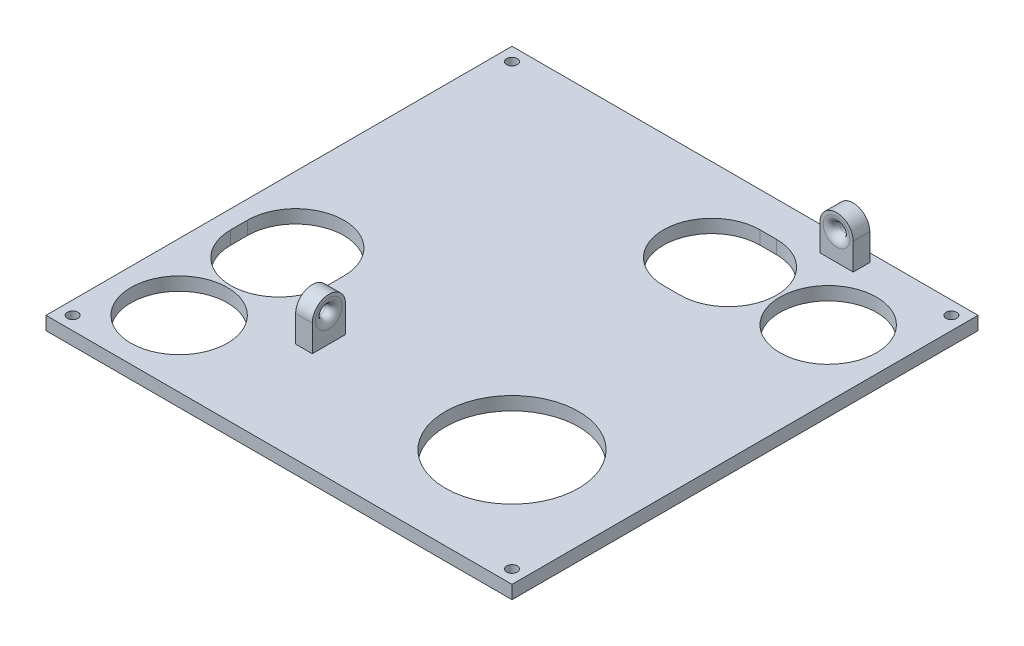
ISO-10303-21;
HEADER;
FILE_DESCRIPTION(('STEP AP214'),'2;1');
FILE_NAME('part.step','',(''),(''),'','','');
FILE_SCHEMA(('AUTOMOTIVE_DESIGN { 1 0 10303 214 1 1 1 1 }'));
ENDSEC;
DATA;
#1=APPLICATION_CONTEXT('core data for automotive mechanical design processes');
#2=APPLICATION_PROTOCOL_DEFINITION('international standard','automotive_design',2000,#1);
#3=PRODUCT_CONTEXT('',#1,'mechanical');
#4=PRODUCT('Part','Part','',(#3));
#5=PRODUCT_RELATED_PRODUCT_CATEGORY('part','',(#4));
#6=PRODUCT_DEFINITION_FORMATION('','',#4);
#7=PRODUCT_DEFINITION_CONTEXT('part definition',#1,'design');
#8=PRODUCT_DEFINITION('design','',#6,#7);
#9=PRODUCT_DEFINITION_SHAPE('','',#8);
#10=(LENGTH_UNIT() NAMED_UNIT(*) SI_UNIT(.MILLI.,.METRE.));
#11=(NAMED_UNIT(*) PLANE_ANGLE_UNIT() SI_UNIT($,.RADIAN.));
#12=(NAMED_UNIT(*) SI_UNIT($,.STERADIAN.) SOLID_ANGLE_UNIT());
#13=UNCERTAINTY_MEASURE_WITH_UNIT(LENGTH_MEASURE(1.E-05),#10,'distance_accuracy_value','');
#14=(GEOMETRIC_REPRESENTATION_CONTEXT(3) GLOBAL_UNCERTAINTY_ASSIGNED_CONTEXT((#13)) GLOBAL_UNIT_ASSIGNED_CONTEXT((#10,
#11,#12)) REPRESENTATION_CONTEXT('',''));
#15=CARTESIAN_POINT('',(0.,0.,0.));
#16=DIRECTION('',(0.,0.,1.));
#17=DIRECTION('',(1.,0.,0.));
#18=AXIS2_PLACEMENT_3D('',#15,#16,#17);
#19=CARTESIAN_POINT('',(-25.,18.,30.));
#20=DIRECTION('',(0.,0.,1.));
#21=DIRECTION('',(1.,0.,0.));
#22=AXIS2_PLACEMENT_3D('',#19,#20,#21);
#23=PLANE('',#22);
#24=DIRECTION('',(1.,0.,0.));
#25=VECTOR('',#24,1.);
#26=CARTESIAN_POINT('',(-25.,12.,30.));
#27=LINE('',#26,#25);
#28=CARTESIAN_POINT('',(-25.,12.,30.));
#29=VERTEX_POINT('',#28);
#30=CARTESIAN_POINT('',(-20.,12.,30.));
#31=VERTEX_POINT('',#30);
#32=EDGE_CURVE('E174',#29,#31,#27,.T.);
#33=ORIENTED_EDGE('',*,*,#32,.T.);
#34=DIRECTION('',(0.,-1.,0.));
#35=VECTOR('',#34,1.);
#36=CARTESIAN_POINT('',(-20.,18.,30.));
#37=LINE('',#36,#35);
#38=CARTESIAN_POINT('',(-20.,4.,30.));
#39=VERTEX_POINT('',#38);
#40=EDGE_CURVE('E194',#31,#39,#37,.T.);
#41=ORIENTED_EDGE('',*,*,#40,.T.);
#42=DIRECTION('',(-1.,0.,0.));
#43=VECTOR('',#42,1.);
#44=CARTESIAN_POINT('',(-25.,4.,30.));
#45=LINE('',#44,#43);
#46=CARTESIAN_POINT('',(-25.,4.,30.));
#47=VERTEX_POINT('',#46);
#48=EDGE_CURVE('E192',#39,#47,#45,.T.);
#49=ORIENTED_EDGE('',*,*,#48,.T.);
#50=DIRECTION('',(0.,-1.,0.));
#51=VECTOR('',#50,1.);
#52=CARTESIAN_POINT('',(-25.,18.,30.));
#53=LINE('',#52,#51);
#54=EDGE_CURVE('E187',#29,#47,#53,.T.);
#55=ORIENTED_EDGE('',*,*,#54,.F.);
#56=EDGE_LOOP('',(#33,#41,#49,#55));
#57=FACE_BOUND('',#56,.T.);
#58=ADVANCED_FACE('F37',(#57),#23,.F.);
#59=CARTESIAN_POINT('',(40.,18.,-67.5));
#60=DIRECTION('',(-1.,0.,0.));
#61=DIRECTION('',(0.,0.,1.));
#62=AXIS2_PLACEMENT_3D('',#59,#60,#61);
#63=PLANE('',#62);
#64=DIRECTION('',(0.,0.,1.));
#65=VECTOR('',#64,1.);
#66=CARTESIAN_POINT('',(40.,12.,-70.));
#67=LINE('',#66,#65);
#68=CARTESIAN_POINT('',(40.,12.,-67.5));
#69=VERTEX_POINT('',#68);
#70=CARTESIAN_POINT('',(40.,12.,-62.5));
#71=VERTEX_POINT('',#70);
#72=EDGE_CURVE('E530',#69,#71,#67,.T.);
#73=ORIENTED_EDGE('',*,*,#72,.T.);
#74=DIRECTION('',(0.,-1.,0.));
#75=VECTOR('',#74,1.);
#76=CARTESIAN_POINT('',(40.,18.,-62.5));
#77=LINE('',#76,#75);
#78=CARTESIAN_POINT('',(40.,4.,-62.5));
#79=VERTEX_POINT('',#78);
#80=EDGE_CURVE('E481',#71,#79,#77,.T.);
#81=ORIENTED_EDGE('',*,*,#80,.T.);
#82=DIRECTION('',(0.,0.,-1.));
#83=VECTOR('',#82,1.);
#84=CARTESIAN_POINT('',(40.,4.,-67.5));
#85=LINE('',#84,#83);
#86=CARTESIAN_POINT('',(40.,4.,-67.5));
#87=VERTEX_POINT('',#86);
#88=EDGE_CURVE('E520',#79,#87,#85,.T.);
#89=ORIENTED_EDGE('',*,*,#88,.T.);
#90=DIRECTION('',(0.,-1.,0.));
#91=VECTOR('',#90,1.);
#92=CARTESIAN_POINT('',(40.,18.,-67.5));
#93=LINE('',#92,#91);
#94=EDGE_CURVE('E498',#69,#87,#93,.T.);
#95=ORIENTED_EDGE('',*,*,#94,.F.);
#96=EDGE_LOOP('',(#73,#81,#89,#95));
#97=FACE_BOUND('',#96,.T.);
#98=ADVANCED_FACE('F366',(#97),#63,.F.);
#99=CARTESIAN_POINT('',(0.,4.,0.));
#100=DIRECTION('',(0.,1.,0.));
#101=DIRECTION('',(0.,0.,1.));
#102=AXIS2_PLACEMENT_3D('',#99,#100,#101);
#103=PLANE('',#102);
#104=DIRECTION('',(0.,0.,1.));
#105=VECTOR('',#104,1.);
#106=CARTESIAN_POINT('',(-64.5,4.,20.));
#107=LINE('',#106,#105);
#108=CARTESIAN_POINT('',(-64.5,4.,15.));
#109=VERTEX_POINT('',#108);
#110=CARTESIAN_POINT('',(-64.5,4.,20.));
#111=VERTEX_POINT('',#110);
#112=EDGE_CURVE('E209',#109,#111,#107,.T.);
#113=ORIENTED_EDGE('',*,*,#112,.F.);
#114=CARTESIAN_POINT('',(-50.,4.,15.));
#115=DIRECTION('',(0.,1.,0.));
#116=DIRECTION('',(0.,0.,1.));
#117=AXIS2_PLACEMENT_3D('',#114,#115,#116);
#118=CIRCLE('',#117,14.5);
#119=CARTESIAN_POINT('',(-35.5,4.,15.));
#120=VERTEX_POINT('',#119);
#121=EDGE_CURVE('E205',#120,#109,#118,.T.);
#122=ORIENTED_EDGE('',*,*,#121,.F.);
#123=DIRECTION('',(0.,0.,-1.));
#124=VECTOR('',#123,1.);
#125=CARTESIAN_POINT('',(-35.5,4.,20.));
#126=LINE('',#125,#124);
#127=CARTESIAN_POINT('',(-35.5,4.,20.));
#128=VERTEX_POINT('',#127);
#129=EDGE_CURVE('E202',#128,#120,#126,.T.);
#130=ORIENTED_EDGE('',*,*,#129,.F.);
#131=CARTESIAN_POINT('',(-50.,4.,20.));
#132=DIRECTION('',(0.,1.,0.));
#133=DIRECTION('',(0.,0.,1.));
#134=AXIS2_PLACEMENT_3D('',#131,#132,#133);
#135=CIRCLE('',#134,14.5);
#136=EDGE_CURVE('E271',#111,#128,#135,.T.);
#137=ORIENTED_EDGE('',*,*,#136,.F.);
#138=EDGE_LOOP('',(#113,#122,#130,#137));
#139=FACE_BOUND('',#138,.T.);
#140=DIRECTION('',(1.,0.,0.));
#141=VECTOR('',#140,1.);
#142=CARTESIAN_POINT('',(20.,4.,-30.5));
#143=LINE('',#142,#141);
#144=CARTESIAN_POINT('',(15.,4.,-30.5));
#145=VERTEX_POINT('',#144);
#146=CARTESIAN_POINT('',(20.,4.,-30.5));
#147=VERTEX_POINT('',#146);
#148=EDGE_CURVE('E221',#145,#147,#143,.T.);
#149=ORIENTED_EDGE('',*,*,#148,.F.);
#150=CARTESIAN_POINT('',(15.,4.,-45.));
#151=DIRECTION('',(0.,1.,0.));
#152=DIRECTION('',(0.,0.,1.));
#153=AXIS2_PLACEMENT_3D('',#150,#151,#152);
#154=CIRCLE('',#153,14.5);
#155=CARTESIAN_POINT('',(15.,4.,-59.5));
#156=VERTEX_POINT('',#155);
#157=EDGE_CURVE('E218',#156,#145,#154,.T.);
#158=ORIENTED_EDGE('',*,*,#157,.F.);
#159=DIRECTION('',(-1.,0.,0.));
#160=VECTOR('',#159,1.);
#161=CARTESIAN_POINT('',(20.,4.,-59.5));
#162=LINE('',#161,#160);
#163=CARTESIAN_POINT('',(20.,4.,-59.5));
#164=VERTEX_POINT('',#163);
#165=EDGE_CURVE('E196',#164,#156,#162,.T.);
#166=ORIENTED_EDGE('',*,*,#165,.F.);
#167=CARTESIAN_POINT('',(20.,4.,-45.));
#168=DIRECTION('',(0.,1.,0.));
#169=DIRECTION('',(0.,0.,1.));
#170=AXIS2_PLACEMENT_3D('',#167,#168,#169);
#171=CIRCLE('',#170,14.5);
#172=EDGE_CURVE('E265',#147,#164,#171,.T.);
#173=ORIENTED_EDGE('',*,*,#172,.F.);
#174=EDGE_LOOP('',(#149,#158,#166,#173));
#175=FACE_BOUND('',#174,.T.);
#176=CARTESIAN_POINT('',(-66.,4.,66.));
#177=DIRECTION('',(0.,1.,0.));
#178=DIRECTION('',(0.,0.,1.));
#179=AXIS2_PLACEMENT_3D('',#176,#177,#178);
#180=CIRCLE('',#179,1.60000000000001);
#181=CARTESIAN_POINT('',(-66.,4.,67.6));
#182=VERTEX_POINT('',#181);
#183=EDGE_CURVE('E237',#182,#182,#180,.T.);
#184=ORIENTED_EDGE('',*,*,#183,.F.);
#185=EDGE_LOOP('',(#184));
#186=FACE_BOUND('',#185,.T.);
#187=CARTESIAN_POINT('',(66.,4.,66.));
#188=DIRECTION('',(0.,1.,0.));
#189=DIRECTION('',(0.,0.,1.));
#190=AXIS2_PLACEMENT_3D('',#187,#188,#189);
#191=CIRCLE('',#190,1.60000000000001);
#192=CARTESIAN_POINT('',(66.,4.,67.6));
#193=VERTEX_POINT('',#192);
#194=EDGE_CURVE('E242',#193,#193,#191,.T.);
#195=ORIENTED_EDGE('',*,*,#194,.F.);
#196=EDGE_LOOP('',(#195));
#197=FACE_BOUND('',#196,.T.);
#198=CARTESIAN_POINT('',(66.,4.,-66.));
#199=DIRECTION('',(0.,1.,0.));
#200=DIRECTION('',(0.,0.,1.));
#201=AXIS2_PLACEMENT_3D('',#198,#199,#200);
#202=CIRCLE('',#201,1.60000000000001);
#203=CARTESIAN_POINT('',(66.,4.,-64.4));
#204=VERTEX_POINT('',#203);
#205=EDGE_CURVE('E238',#204,#204,#202,.T.);
#206=ORIENTED_EDGE('',*,*,#205,.F.);
#207=EDGE_LOOP('',(#206));
#208=FACE_BOUND('',#207,.T.);
#209=CARTESIAN_POINT('',(-66.,4.,-66.));
#210=DIRECTION('',(0.,1.,0.));
#211=DIRECTION('',(0.,0.,1.));
#212=AXIS2_PLACEMENT_3D('',#209,#210,#211);
#213=CIRCLE('',#212,1.60000000000001);
#214=CARTESIAN_POINT('',(-66.,4.,-64.4));
#215=VERTEX_POINT('',#214);
#216=EDGE_CURVE('E241',#215,#215,#213,.T.);
#217=ORIENTED_EDGE('',*,*,#216,.F.);
#218=EDGE_LOOP('',(#217));
#219=FACE_BOUND('',#218,.T.);
#220=CARTESIAN_POINT('',(35.,4.,35.));
#221=DIRECTION('',(0.,1.,0.));
#222=DIRECTION('',(0.,0.,1.));
#223=AXIS2_PLACEMENT_3D('',#220,#221,#222);
#224=CIRCLE('',#223,20.);
#225=CARTESIAN_POINT('',(35.,4.,55.));
#226=VERTEX_POINT('',#225);
#227=EDGE_CURVE('E250',#226,#226,#224,.T.);
#228=ORIENTED_EDGE('',*,*,#227,.F.);
#229=EDGE_LOOP('',(#228));
#230=FACE_BOUND('',#229,.T.);
#231=CARTESIAN_POINT('',(50.,4.,-45.));
#232=DIRECTION('',(0.,1.,0.));
#233=DIRECTION('',(0.,0.,1.));
#234=AXIS2_PLACEMENT_3D('',#231,#232,#233);
#235=CIRCLE('',#234,14.5);
#236=CARTESIAN_POINT('',(50.,4.,-30.5));
#237=VERTEX_POINT('',#236);
#238=EDGE_CURVE('E259',#237,#237,#235,.T.);
#239=ORIENTED_EDGE('',*,*,#238,.F.);
#240=EDGE_LOOP('',(#239));
#241=FACE_BOUND('',#240,.T.);
#242=CARTESIAN_POINT('',(-50.,4.,50.));
#243=DIRECTION('',(0.,1.,0.));
#244=DIRECTION('',(0.,0.,1.));
#245=AXIS2_PLACEMENT_3D('',#242,#243,#244);
#246=CIRCLE('',#245,14.5);
#247=CARTESIAN_POINT('',(-50.,4.,64.5));
#248=VERTEX_POINT('',#247);
#249=EDGE_CURVE('E277',#248,#248,#246,.T.);
#250=ORIENTED_EDGE('',*,*,#249,.F.);
#251=EDGE_LOOP('',(#250));
#252=FACE_BOUND('',#251,.T.);
#253=DIRECTION('',(0.,0.,-1.));
#254=VECTOR('',#253,1.);
#255=CARTESIAN_POINT('',(70.,4.,-70.));
#256=LINE('',#255,#254);
#257=CARTESIAN_POINT('',(70.,4.,70.));
#258=VERTEX_POINT('',#257);
#259=CARTESIAN_POINT('',(70.,4.,-70.));
#260=VERTEX_POINT('',#259);
#261=EDGE_CURVE('E280',#258,#260,#256,.T.);
#262=ORIENTED_EDGE('',*,*,#261,.T.);
#263=DIRECTION('',(-1.,0.,0.));
#264=VECTOR('',#263,1.);
#265=CARTESIAN_POINT('',(-70.,4.,-70.));
#266=LINE('',#265,#264);
#267=CARTESIAN_POINT('',(-70.,4.,-70.));
#268=VERTEX_POINT('',#267);
#269=EDGE_CURVE('E283',#260,#268,#266,.T.);
#270=ORIENTED_EDGE('',*,*,#269,.T.);
#271=DIRECTION('',(0.,0.,1.));
#272=VECTOR('',#271,1.);
#273=CARTESIAN_POINT('',(-70.,4.,-70.));
#274=LINE('',#273,#272);
#275=CARTESIAN_POINT('',(-70.,4.,70.));
#276=VERTEX_POINT('',#275);
#277=EDGE_CURVE('E286',#268,#276,#274,.T.);
#278=ORIENTED_EDGE('',*,*,#277,.T.);
#279=DIRECTION('',(1.,0.,0.));
#280=VECTOR('',#279,1.);
#281=CARTESIAN_POINT('',(-70.,4.,70.));
#282=LINE('',#281,#280);
#283=EDGE_CURVE('E288',#276,#258,#282,.T.);
#284=ORIENTED_EDGE('',*,*,#283,.T.);
#285=EDGE_LOOP('',(#262,#270,#278,#284));
#286=FACE_BOUND('',#285,.T.);
#287=ORIENTED_EDGE('',*,*,#48,.F.);
#288=DIRECTION('',(0.,0.,-1.));
#289=VECTOR('',#288,1.);
#290=CARTESIAN_POINT('',(-20.,4.,30.));
#291=LINE('',#290,#289);
#292=CARTESIAN_POINT('',(-20.,4.,40.));
#293=VERTEX_POINT('',#292);
#294=EDGE_CURVE('E500',#293,#39,#291,.T.);
#295=ORIENTED_EDGE('',*,*,#294,.F.);
#296=DIRECTION('',(1.,0.,0.));
#297=VECTOR('',#296,1.);
#298=CARTESIAN_POINT('',(-25.,4.,40.));
#299=LINE('',#298,#297);
#300=CARTESIAN_POINT('',(-25.,4.,40.));
#301=VERTEX_POINT('',#300);
#302=EDGE_CURVE('E506',#301,#293,#299,.T.);
#303=ORIENTED_EDGE('',*,*,#302,.F.);
#304=DIRECTION('',(0.,0.,1.));
#305=VECTOR('',#304,1.);
#306=CARTESIAN_POINT('',(-25.,4.,30.));
#307=LINE('',#306,#305);
#308=EDGE_CURVE('E504',#47,#301,#307,.T.);
#309=ORIENTED_EDGE('',*,*,#308,.F.);
#310=EDGE_LOOP('',(#287,#295,#303,#309));
#311=FACE_BOUND('',#310,.T.);
#312=DIRECTION('',(-1.,0.,0.));
#313=VECTOR('',#312,1.);
#314=CARTESIAN_POINT('',(30.,4.,-67.5));
#315=LINE('',#314,#313);
#316=CARTESIAN_POINT('',(30.,4.,-67.5));
#317=VERTEX_POINT('',#316);
#318=EDGE_CURVE('E519',#87,#317,#315,.T.);
#319=ORIENTED_EDGE('',*,*,#318,.F.);
#320=ORIENTED_EDGE('',*,*,#88,.F.);
#321=DIRECTION('',(1.,0.,0.));
#322=VECTOR('',#321,1.);
#323=CARTESIAN_POINT('',(30.,4.,-62.5));
#324=LINE('',#323,#322);
#325=CARTESIAN_POINT('',(30.,4.,-62.5));
#326=VERTEX_POINT('',#325);
#327=EDGE_CURVE('E485',#326,#79,#324,.T.);
#328=ORIENTED_EDGE('',*,*,#327,.F.);
#329=DIRECTION('',(0.,0.,1.));
#330=VECTOR('',#329,1.);
#331=CARTESIAN_POINT('',(30.,4.,-67.5));
#332=LINE('',#331,#330);
#333=EDGE_CURVE('E493',#317,#326,#332,.T.);
#334=ORIENTED_EDGE('',*,*,#333,.F.);
#335=EDGE_LOOP('',(#319,#320,#328,#334));
#336=FACE_BOUND('',#335,.T.);
#337=ADVANCED_FACE('F371',(#139,#175,#186,#197,#208,#219,#230,#241,#252,#286,#311,#336),#103,.T.);
#338=CARTESIAN_POINT('',(-50.,0.,20.));
#339=DIRECTION('',(0.,1.,0.));
#340=DIRECTION('',(0.,0.,1.));
#341=AXIS2_PLACEMENT_3D('',#338,#339,#340);
#342=CYLINDRICAL_SURFACE('',#341,14.5);
#343=DIRECTION('',(0.,1.,0.));
#344=VECTOR('',#343,1.);
#345=CARTESIAN_POINT('',(-64.5,0.,20.));
#346=LINE('',#345,#344);
#347=CARTESIAN_POINT('',(-64.5,0.,20.));
#348=VERTEX_POINT('',#347);
#349=EDGE_CURVE('E329',#111,#348,#346,.F.);
#350=ORIENTED_EDGE('',*,*,#349,.F.);
#351=ORIENTED_EDGE('',*,*,#136,.T.);
#352=DIRECTION('',(0.,1.,0.));
#353=VECTOR('',#352,1.);
#354=CARTESIAN_POINT('',(-35.5,0.,20.));
#355=LINE('',#354,#353);
#356=CARTESIAN_POINT('',(-35.5,0.,20.));
#357=VERTEX_POINT('',#356);
#358=EDGE_CURVE('E326',#128,#357,#355,.F.);
#359=ORIENTED_EDGE('',*,*,#358,.T.);
#360=CARTESIAN_POINT('',(-50.,0.,20.));
#361=DIRECTION('',(0.,1.,0.));
#362=DIRECTION('',(0.,0.,1.));
#363=AXIS2_PLACEMENT_3D('',#360,#361,#362);
#364=CIRCLE('',#363,14.5);
#365=EDGE_CURVE('E268',#348,#357,#364,.T.);
#366=ORIENTED_EDGE('',*,*,#365,.F.);
#367=EDGE_LOOP('',(#350,#351,#359,#366));
#368=FACE_BOUND('',#367,.T.);
#369=ADVANCED_FACE('F434',(#368),#342,.F.);
#370=CARTESIAN_POINT('',(20.,0.,-45.));
#371=DIRECTION('',(0.,1.,0.));
#372=DIRECTION('',(0.,0.,1.));
#373=AXIS2_PLACEMENT_3D('',#370,#371,#372);
#374=CYLINDRICAL_SURFACE('',#373,14.5);
#375=DIRECTION('',(0.,1.,0.));
#376=VECTOR('',#375,1.);
#377=CARTESIAN_POINT('',(20.,0.,-30.5));
#378=LINE('',#377,#376);
#379=CARTESIAN_POINT('',(20.,0.,-30.5));
#380=VERTEX_POINT('',#379);
#381=EDGE_CURVE('E324',#147,#380,#378,.F.);
#382=ORIENTED_EDGE('',*,*,#381,.F.);
#383=ORIENTED_EDGE('',*,*,#172,.T.);
#384=DIRECTION('',(0.,1.,0.));
#385=VECTOR('',#384,1.);
#386=CARTESIAN_POINT('',(20.,0.,-59.5));
#387=LINE('',#386,#385);
#388=CARTESIAN_POINT('',(20.,0.,-59.5));
#389=VERTEX_POINT('',#388);
#390=EDGE_CURVE('E309',#164,#389,#387,.F.);
#391=ORIENTED_EDGE('',*,*,#390,.T.);
#392=CARTESIAN_POINT('',(20.,0.,-45.));
#393=DIRECTION('',(0.,1.,0.));
#394=DIRECTION('',(0.,0.,1.));
#395=AXIS2_PLACEMENT_3D('',#392,#393,#394);
#396=CIRCLE('',#395,14.5);
#397=EDGE_CURVE('E262',#380,#389,#396,.T.);
#398=ORIENTED_EDGE('',*,*,#397,.F.);
#399=EDGE_LOOP('',(#382,#383,#391,#398));
#400=FACE_BOUND('',#399,.T.);
#401=ADVANCED_FACE('F430',(#400),#374,.F.);
#402=CARTESIAN_POINT('',(70.,4.,-70.));
#403=DIRECTION('',(-1.,0.,0.));
#404=DIRECTION('',(0.,0.,1.));
#405=AXIS2_PLACEMENT_3D('',#402,#403,#404);
#406=PLANE('',#405);
#407=DIRECTION('',(0.,0.,-1.));
#408=VECTOR('',#407,1.);
#409=CARTESIAN_POINT('',(70.,0.,-70.));
#410=LINE('',#409,#408);
#411=CARTESIAN_POINT('',(70.,0.,70.));
#412=VERTEX_POINT('',#411);
#413=CARTESIAN_POINT('',(70.,0.,-70.));
#414=VERTEX_POINT('',#413);
#415=EDGE_CURVE('E258',#412,#414,#410,.T.);
#416=ORIENTED_EDGE('',*,*,#415,.T.);
#417=DIRECTION('',(0.,-1.,0.));
#418=VECTOR('',#417,1.);
#419=CARTESIAN_POINT('',(70.,4.,-70.));
#420=LINE('',#419,#418);
#421=EDGE_CURVE('E306',#260,#414,#420,.T.);
#422=ORIENTED_EDGE('',*,*,#421,.F.);
#423=ORIENTED_EDGE('',*,*,#261,.F.);
#424=DIRECTION('',(0.,-1.,0.));
#425=VECTOR('',#424,1.);
#426=CARTESIAN_POINT('',(70.,4.,70.));
#427=LINE('',#426,#425);
#428=EDGE_CURVE('E290',#258,#412,#427,.T.);
#429=ORIENTED_EDGE('',*,*,#428,.T.);
#430=EDGE_LOOP('',(#416,#422,#423,#429));
#431=FACE_BOUND('',#430,.T.);
#432=ADVANCED_FACE('F433',(#431),#406,.F.);
#433=CARTESIAN_POINT('',(-70.,4.,-70.));
#434=DIRECTION('',(0.,0.,1.));
#435=DIRECTION('',(1.,0.,0.));
#436=AXIS2_PLACEMENT_3D('',#433,#434,#435);
#437=PLANE('',#436);
#438=DIRECTION('',(-1.,0.,0.));
#439=VECTOR('',#438,1.);
#440=CARTESIAN_POINT('',(-70.,0.,-70.));
#441=LINE('',#440,#439);
#442=CARTESIAN_POINT('',(-70.,0.,-70.));
#443=VERTEX_POINT('',#442);
#444=EDGE_CURVE('E293',#414,#443,#441,.T.);
#445=ORIENTED_EDGE('',*,*,#444,.T.);
#446=DIRECTION('',(0.,-1.,0.));
#447=VECTOR('',#446,1.);
#448=CARTESIAN_POINT('',(-70.,4.,-70.));
#449=LINE('',#448,#447);
#450=EDGE_CURVE('E303',#268,#443,#449,.T.);
#451=ORIENTED_EDGE('',*,*,#450,.F.);
#452=ORIENTED_EDGE('',*,*,#269,.F.);
#453=ORIENTED_EDGE('',*,*,#421,.T.);
#454=EDGE_LOOP('',(#445,#451,#452,#453));
#455=FACE_BOUND('',#454,.T.);
#456=ADVANCED_FACE('F456',(#455),#437,.F.);
#457=CARTESIAN_POINT('',(-70.,4.,-70.));
#458=DIRECTION('',(1.,0.,0.));
#459=DIRECTION('',(0.,0.,-1.));
#460=AXIS2_PLACEMENT_3D('',#457,#458,#459);
#461=PLANE('',#460);
#462=DIRECTION('',(0.,0.,1.));
#463=VECTOR('',#462,1.);
#464=CARTESIAN_POINT('',(-70.,0.,-70.));
#465=LINE('',#464,#463);
#466=CARTESIAN_POINT('',(-70.,0.,70.));
#467=VERTEX_POINT('',#466);
#468=EDGE_CURVE('E295',#443,#467,#465,.T.);
#469=ORIENTED_EDGE('',*,*,#468,.T.);
#470=DIRECTION('',(0.,-1.,0.));
#471=VECTOR('',#470,1.);
#472=CARTESIAN_POINT('',(-70.,4.,70.));
#473=LINE('',#472,#471);
#474=EDGE_CURVE('E300',#276,#467,#473,.T.);
#475=ORIENTED_EDGE('',*,*,#474,.F.);
#476=ORIENTED_EDGE('',*,*,#277,.F.);
#477=ORIENTED_EDGE('',*,*,#450,.T.);
#478=EDGE_LOOP('',(#469,#475,#476,#477));
#479=FACE_BOUND('',#478,.T.);
#480=ADVANCED_FACE('F452',(#479),#461,.F.);
#481=CARTESIAN_POINT('',(-70.,4.,70.));
#482=DIRECTION('',(0.,0.,-1.));
#483=DIRECTION('',(-1.,0.,0.));
#484=AXIS2_PLACEMENT_3D('',#481,#482,#483);
#485=PLANE('',#484);
#486=DIRECTION('',(1.,0.,0.));
#487=VECTOR('',#486,1.);
#488=CARTESIAN_POINT('',(-70.,0.,70.));
#489=LINE('',#488,#487);
#490=EDGE_CURVE('E284',#467,#412,#489,.T.);
#491=ORIENTED_EDGE('',*,*,#490,.T.);
#492=ORIENTED_EDGE('',*,*,#428,.F.);
#493=ORIENTED_EDGE('',*,*,#283,.F.);
#494=ORIENTED_EDGE('',*,*,#474,.T.);
#495=EDGE_LOOP('',(#491,#492,#493,#494));
#496=FACE_BOUND('',#495,.T.);
#497=ADVANCED_FACE('F448',(#496),#485,.F.);
#498=CARTESIAN_POINT('',(0.,0.,0.));
#499=DIRECTION('',(0.,1.,0.));
#500=DIRECTION('',(0.,0.,1.));
#501=AXIS2_PLACEMENT_3D('',#498,#499,#500);
#502=PLANE('',#501);
#503=CARTESIAN_POINT('',(-66.,0.,66.));
#504=DIRECTION('',(0.,1.,0.));
#505=DIRECTION('',(0.,0.,1.));
#506=AXIS2_PLACEMENT_3D('',#503,#504,#505);
#507=CIRCLE('',#506,1.60000000000001);
#508=CARTESIAN_POINT('',(-66.,0.,67.6));
#509=VERTEX_POINT('',#508);
#510=EDGE_CURVE('E254',#509,#509,#507,.T.);
#511=ORIENTED_EDGE('',*,*,#510,.T.);
#512=EDGE_LOOP('',(#511));
#513=FACE_BOUND('',#512,.T.);
#514=CARTESIAN_POINT('',(66.,0.,66.));
#515=DIRECTION('',(0.,1.,0.));
#516=DIRECTION('',(0.,0.,1.));
#517=AXIS2_PLACEMENT_3D('',#514,#515,#516);
#518=CIRCLE('',#517,1.60000000000001);
#519=CARTESIAN_POINT('',(66.,0.,67.6));
#520=VERTEX_POINT('',#519);
#521=EDGE_CURVE('E317',#520,#520,#518,.T.);
#522=ORIENTED_EDGE('',*,*,#521,.T.);
#523=EDGE_LOOP('',(#522));
#524=FACE_BOUND('',#523,.T.);
#525=CARTESIAN_POINT('',(66.,0.,-66.));
#526=DIRECTION('',(0.,1.,0.));
#527=DIRECTION('',(0.,0.,1.));
#528=AXIS2_PLACEMENT_3D('',#525,#526,#527);
#529=CIRCLE('',#528,1.60000000000001);
#530=CARTESIAN_POINT('',(66.,0.,-64.4));
#531=VERTEX_POINT('',#530);
#532=EDGE_CURVE('E314',#531,#531,#529,.T.);
#533=ORIENTED_EDGE('',*,*,#532,.T.);
#534=EDGE_LOOP('',(#533));
#535=FACE_BOUND('',#534,.T.);
#536=CARTESIAN_POINT('',(-66.,0.,-66.));
#537=DIRECTION('',(0.,1.,0.));
#538=DIRECTION('',(0.,0.,1.));
#539=AXIS2_PLACEMENT_3D('',#536,#537,#538);
#540=CIRCLE('',#539,1.60000000000001);
#541=CARTESIAN_POINT('',(-66.,0.,-64.4));
#542=VERTEX_POINT('',#541);
#543=EDGE_CURVE('E249',#542,#542,#540,.T.);
#544=ORIENTED_EDGE('',*,*,#543,.T.);
#545=EDGE_LOOP('',(#544));
#546=FACE_BOUND('',#545,.T.);
#547=CARTESIAN_POINT('',(35.,0.,35.));
#548=DIRECTION('',(0.,1.,0.));
#549=DIRECTION('',(0.,0.,1.));
#550=AXIS2_PLACEMENT_3D('',#547,#548,#549);
#551=CIRCLE('',#550,20.);
#552=CARTESIAN_POINT('',(35.,0.,55.));
#553=VERTEX_POINT('',#552);
#554=EDGE_CURVE('E253',#553,#553,#551,.T.);
#555=ORIENTED_EDGE('',*,*,#554,.T.);
#556=EDGE_LOOP('',(#555));
#557=FACE_BOUND('',#556,.T.);
#558=CARTESIAN_POINT('',(50.,0.,-45.));
#559=DIRECTION('',(0.,1.,0.));
#560=DIRECTION('',(0.,0.,1.));
#561=AXIS2_PLACEMENT_3D('',#558,#559,#560);
#562=CIRCLE('',#561,14.5);
#563=CARTESIAN_POINT('',(50.,0.,-30.5));
#564=VERTEX_POINT('',#563);
#565=EDGE_CURVE('E255',#564,#564,#562,.T.);
#566=ORIENTED_EDGE('',*,*,#565,.T.);
#567=EDGE_LOOP('',(#566));
#568=FACE_BOUND('',#567,.T.);
#569=CARTESIAN_POINT('',(15.,0.,-45.));
#570=DIRECTION('',(0.,1.,0.));
#571=DIRECTION('',(0.,0.,1.));
#572=AXIS2_PLACEMENT_3D('',#569,#570,#571);
#573=CIRCLE('',#572,14.5);
#574=CARTESIAN_POINT('',(15.,0.,-59.5));
#575=VERTEX_POINT('',#574);
#576=CARTESIAN_POINT('',(15.,0.,-30.5));
#577=VERTEX_POINT('',#576);
#578=EDGE_CURVE('E331',#575,#577,#573,.T.);
#579=ORIENTED_EDGE('',*,*,#578,.T.);
#580=DIRECTION('',(1.,0.,0.));
#581=VECTOR('',#580,1.);
#582=CARTESIAN_POINT('',(0.,0.,-30.5));
#583=LINE('',#582,#581);
#584=EDGE_CURVE('E228',#577,#380,#583,.T.);
#585=ORIENTED_EDGE('',*,*,#584,.T.);
#586=ORIENTED_EDGE('',*,*,#397,.T.);
#587=DIRECTION('',(-1.,0.,0.));
#588=VECTOR('',#587,1.);
#589=CARTESIAN_POINT('',(0.,0.,-59.5));
#590=LINE('',#589,#588);
#591=EDGE_CURVE('E214',#389,#575,#590,.T.);
#592=ORIENTED_EDGE('',*,*,#591,.T.);
#593=EDGE_LOOP('',(#579,#585,#586,#592));
#594=FACE_BOUND('',#593,.T.);
#595=CARTESIAN_POINT('',(-50.,0.,15.));
#596=DIRECTION('',(0.,1.,0.));
#597=DIRECTION('',(0.,0.,1.));
#598=AXIS2_PLACEMENT_3D('',#595,#596,#597);
#599=CIRCLE('',#598,14.5);
#600=CARTESIAN_POINT('',(-35.5,0.,15.));
#601=VERTEX_POINT('',#600);
#602=CARTESIAN_POINT('',(-64.5,0.,15.));
#603=VERTEX_POINT('',#602);
#604=EDGE_CURVE('E334',#601,#603,#599,.T.);
#605=ORIENTED_EDGE('',*,*,#604,.T.);
#606=DIRECTION('',(0.,0.,1.));
#607=VECTOR('',#606,1.);
#608=CARTESIAN_POINT('',(-64.5,0.,0.));
#609=LINE('',#608,#607);
#610=EDGE_CURVE('E234',#603,#348,#609,.T.);
#611=ORIENTED_EDGE('',*,*,#610,.T.);
#612=ORIENTED_EDGE('',*,*,#365,.T.);
#613=DIRECTION('',(0.,0.,-1.));
#614=VECTOR('',#613,1.);
#615=CARTESIAN_POINT('',(-35.5,0.,0.));
#616=LINE('',#615,#614);
#617=EDGE_CURVE('E231',#357,#601,#616,.T.);
#618=ORIENTED_EDGE('',*,*,#617,.T.);
#619=EDGE_LOOP('',(#605,#611,#612,#618));
#620=FACE_BOUND('',#619,.T.);
#621=CARTESIAN_POINT('',(-50.,0.,50.));
#622=DIRECTION('',(0.,1.,0.));
#623=DIRECTION('',(0.,0.,1.));
#624=AXIS2_PLACEMENT_3D('',#621,#622,#623);
#625=CIRCLE('',#624,14.5);
#626=CARTESIAN_POINT('',(-50.,0.,64.5));
#627=VERTEX_POINT('',#626);
#628=EDGE_CURVE('E274',#627,#627,#625,.T.);
#629=ORIENTED_EDGE('',*,*,#628,.T.);
#630=EDGE_LOOP('',(#629));
#631=FACE_BOUND('',#630,.T.);
#632=ORIENTED_EDGE('',*,*,#415,.F.);
#633=ORIENTED_EDGE('',*,*,#490,.F.);
#634=ORIENTED_EDGE('',*,*,#468,.F.);
#635=ORIENTED_EDGE('',*,*,#444,.F.);
#636=EDGE_LOOP('',(#632,#633,#634,#635));
#637=FACE_BOUND('',#636,.T.);
#638=ADVANCED_FACE('F441',(#513,#524,#535,#546,#557,#568,#594,#620,#631,#637),#502,.F.);
#639=CARTESIAN_POINT('',(-50.,0.,50.));
#640=DIRECTION('',(0.,1.,0.));
#641=DIRECTION('',(0.,0.,1.));
#642=AXIS2_PLACEMENT_3D('',#639,#640,#641);
#643=CYLINDRICAL_SURFACE('',#642,14.5);
#644=ORIENTED_EDGE('',*,*,#628,.F.);
#645=EDGE_LOOP('',(#644));
#646=FACE_BOUND('',#645,.T.);
#647=ORIENTED_EDGE('',*,*,#249,.T.);
#648=EDGE_LOOP('',(#647));
#649=FACE_BOUND('',#648,.T.);
#650=ADVANCED_FACE('F428',(#646,#649),#643,.F.);
#651=CARTESIAN_POINT('',(50.,0.,-45.));
#652=DIRECTION('',(0.,1.,0.));
#653=DIRECTION('',(0.,0.,1.));
#654=AXIS2_PLACEMENT_3D('',#651,#652,#653);
#655=CYLINDRICAL_SURFACE('',#654,14.5);
#656=ORIENTED_EDGE('',*,*,#565,.F.);
#657=EDGE_LOOP('',(#656));
#658=FACE_BOUND('',#657,.T.);
#659=ORIENTED_EDGE('',*,*,#238,.T.);
#660=EDGE_LOOP('',(#659));
#661=FACE_BOUND('',#660,.T.);
#662=ADVANCED_FACE('F424',(#658,#661),#655,.F.);
#663=CARTESIAN_POINT('',(35.,-6.,35.));
#664=DIRECTION('',(0.,1.,0.));
#665=DIRECTION('',(0.,0.,1.));
#666=AXIS2_PLACEMENT_3D('',#663,#664,#665);
#667=CYLINDRICAL_SURFACE('',#666,20.);
#668=ORIENTED_EDGE('',*,*,#227,.T.);
#669=EDGE_LOOP('',(#668));
#670=FACE_BOUND('',#669,.T.);
#671=ORIENTED_EDGE('',*,*,#554,.F.);
#672=EDGE_LOOP('',(#671));
#673=FACE_BOUND('',#672,.T.);
#674=ADVANCED_FACE('F420',(#670,#673),#667,.F.);
#675=CARTESIAN_POINT('',(-66.,-6.,-66.));
#676=DIRECTION('',(0.,1.,0.));
#677=DIRECTION('',(0.,0.,1.));
#678=AXIS2_PLACEMENT_3D('',#675,#676,#677);
#679=CYLINDRICAL_SURFACE('',#678,1.60000000000001);
#680=ORIENTED_EDGE('',*,*,#216,.T.);
#681=EDGE_LOOP('',(#680));
#682=FACE_BOUND('',#681,.T.);
#683=ORIENTED_EDGE('',*,*,#543,.F.);
#684=EDGE_LOOP('',(#683));
#685=FACE_BOUND('',#684,.T.);
#686=ADVANCED_FACE('F410',(#682,#685),#679,.F.);
#687=CARTESIAN_POINT('',(66.,-6.,-66.));
#688=DIRECTION('',(0.,1.,0.));
#689=DIRECTION('',(0.,0.,1.));
#690=AXIS2_PLACEMENT_3D('',#687,#688,#689);
#691=CYLINDRICAL_SURFACE('',#690,1.60000000000001);
#692=ORIENTED_EDGE('',*,*,#205,.T.);
#693=EDGE_LOOP('',(#692));
#694=FACE_BOUND('',#693,.T.);
#695=ORIENTED_EDGE('',*,*,#532,.F.);
#696=EDGE_LOOP('',(#695));
#697=FACE_BOUND('',#696,.T.);
#698=ADVANCED_FACE('F406',(#694,#697),#691,.F.);
#699=CARTESIAN_POINT('',(66.,-6.,66.));
#700=DIRECTION('',(0.,1.,0.));
#701=DIRECTION('',(0.,0.,1.));
#702=AXIS2_PLACEMENT_3D('',#699,#700,#701);
#703=CYLINDRICAL_SURFACE('',#702,1.60000000000001);
#704=ORIENTED_EDGE('',*,*,#194,.T.);
#705=EDGE_LOOP('',(#704));
#706=FACE_BOUND('',#705,.T.);
#707=ORIENTED_EDGE('',*,*,#521,.F.);
#708=EDGE_LOOP('',(#707));
#709=FACE_BOUND('',#708,.T.);
#710=ADVANCED_FACE('F409',(#706,#709),#703,.F.);
#711=CARTESIAN_POINT('',(-66.,-6.,66.));
#712=DIRECTION('',(0.,1.,0.));
#713=DIRECTION('',(0.,0.,1.));
#714=AXIS2_PLACEMENT_3D('',#711,#712,#713);
#715=CYLINDRICAL_SURFACE('',#714,1.60000000000001);
#716=ORIENTED_EDGE('',*,*,#183,.T.);
#717=EDGE_LOOP('',(#716));
#718=FACE_BOUND('',#717,.T.);
#719=ORIENTED_EDGE('',*,*,#510,.F.);
#720=EDGE_LOOP('',(#719));
#721=FACE_BOUND('',#720,.T.);
#722=ADVANCED_FACE('F401',(#718,#721),#715,.F.);
#723=CARTESIAN_POINT('',(15.,-6.,-45.));
#724=DIRECTION('',(0.,1.,0.));
#725=DIRECTION('',(0.,0.,1.));
#726=AXIS2_PLACEMENT_3D('',#723,#724,#725);
#727=CYLINDRICAL_SURFACE('',#726,14.5);
#728=DIRECTION('',(0.,1.,0.));
#729=VECTOR('',#728,1.);
#730=CARTESIAN_POINT('',(15.,-6.,-59.5));
#731=LINE('',#730,#729);
#732=EDGE_CURVE('E223',#575,#156,#731,.T.);
#733=ORIENTED_EDGE('',*,*,#732,.T.);
#734=ORIENTED_EDGE('',*,*,#157,.T.);
#735=DIRECTION('',(0.,1.,0.));
#736=VECTOR('',#735,1.);
#737=CARTESIAN_POINT('',(15.,-6.,-30.5));
#738=LINE('',#737,#736);
#739=EDGE_CURVE('E206',#577,#145,#738,.T.);
#740=ORIENTED_EDGE('',*,*,#739,.F.);
#741=ORIENTED_EDGE('',*,*,#578,.F.);
#742=EDGE_LOOP('',(#733,#734,#740,#741));
#743=FACE_BOUND('',#742,.T.);
#744=ADVANCED_FACE('F397',(#743),#727,.F.);
#745=CARTESIAN_POINT('',(20.,-6.,-30.5));
#746=DIRECTION('',(0.,0.,1.));
#747=DIRECTION('',(1.,0.,0.));
#748=AXIS2_PLACEMENT_3D('',#745,#746,#747);
#749=PLANE('',#748);
#750=ORIENTED_EDGE('',*,*,#739,.T.);
#751=ORIENTED_EDGE('',*,*,#148,.T.);
#752=ORIENTED_EDGE('',*,*,#381,.T.);
#753=ORIENTED_EDGE('',*,*,#584,.F.);
#754=EDGE_LOOP('',(#750,#751,#752,#753));
#755=FACE_BOUND('',#754,.T.);
#756=ADVANCED_FACE('F394',(#755),#749,.F.);
#757=CARTESIAN_POINT('',(20.,-6.,-59.5));
#758=DIRECTION('',(0.,0.,-1.));
#759=DIRECTION('',(-1.,0.,0.));
#760=AXIS2_PLACEMENT_3D('',#757,#758,#759);
#761=PLANE('',#760);
#762=ORIENTED_EDGE('',*,*,#390,.F.);
#763=ORIENTED_EDGE('',*,*,#165,.T.);
#764=ORIENTED_EDGE('',*,*,#732,.F.);
#765=ORIENTED_EDGE('',*,*,#591,.F.);
#766=EDGE_LOOP('',(#762,#763,#764,#765));
#767=FACE_BOUND('',#766,.T.);
#768=ADVANCED_FACE('F389',(#767),#761,.F.);
#769=CARTESIAN_POINT('',(-50.,-6.,15.));
#770=DIRECTION('',(0.,1.,0.));
#771=DIRECTION('',(0.,0.,1.));
#772=AXIS2_PLACEMENT_3D('',#769,#770,#771);
#773=CYLINDRICAL_SURFACE('',#772,14.5);
#774=DIRECTION('',(0.,1.,0.));
#775=VECTOR('',#774,1.);
#776=CARTESIAN_POINT('',(-35.5,-6.,15.));
#777=LINE('',#776,#775);
#778=EDGE_CURVE('E211',#601,#120,#777,.T.);
#779=ORIENTED_EDGE('',*,*,#778,.T.);
#780=ORIENTED_EDGE('',*,*,#121,.T.);
#781=DIRECTION('',(0.,1.,0.));
#782=VECTOR('',#781,1.);
#783=CARTESIAN_POINT('',(-64.5,-6.,15.));
#784=LINE('',#783,#782);
#785=EDGE_CURVE('E212',#603,#109,#784,.T.);
#786=ORIENTED_EDGE('',*,*,#785,.F.);
#787=ORIENTED_EDGE('',*,*,#604,.F.);
#788=EDGE_LOOP('',(#779,#780,#786,#787));
#789=FACE_BOUND('',#788,.T.);
#790=ADVANCED_FACE('F385',(#789),#773,.F.);
#791=CARTESIAN_POINT('',(-64.5,-6.,20.));
#792=DIRECTION('',(-1.,0.,0.));
#793=DIRECTION('',(0.,0.,1.));
#794=AXIS2_PLACEMENT_3D('',#791,#792,#793);
#795=PLANE('',#794);
#796=ORIENTED_EDGE('',*,*,#785,.T.);
#797=ORIENTED_EDGE('',*,*,#112,.T.);
#798=ORIENTED_EDGE('',*,*,#349,.T.);
#799=ORIENTED_EDGE('',*,*,#610,.F.);
#800=EDGE_LOOP('',(#796,#797,#798,#799));
#801=FACE_BOUND('',#800,.T.);
#802=ADVANCED_FACE('F382',(#801),#795,.F.);
#803=CARTESIAN_POINT('',(-35.5,-6.,20.));
#804=DIRECTION('',(1.,0.,0.));
#805=DIRECTION('',(0.,0.,-1.));
#806=AXIS2_PLACEMENT_3D('',#803,#804,#805);
#807=PLANE('',#806);
#808=ORIENTED_EDGE('',*,*,#358,.F.);
#809=ORIENTED_EDGE('',*,*,#129,.T.);
#810=ORIENTED_EDGE('',*,*,#778,.F.);
#811=ORIENTED_EDGE('',*,*,#617,.F.);
#812=EDGE_LOOP('',(#808,#809,#810,#811));
#813=FACE_BOUND('',#812,.T.);
#814=ADVANCED_FACE('F380',(#813),#807,.F.);
#815=CARTESIAN_POINT('',(-20.,18.,30.));
#816=DIRECTION('',(-1.,0.,0.));
#817=DIRECTION('',(0.,0.,1.));
#818=AXIS2_PLACEMENT_3D('',#815,#816,#817);
#819=PLANE('',#818);
#820=CARTESIAN_POINT('',(-20.,12.,35.));
#821=DIRECTION('',(-1.,0.,0.));
#822=DIRECTION('',(0.,0.,1.));
#823=AXIS2_PLACEMENT_3D('',#820,#821,#822);
#824=CIRCLE('',#823,4.);
#825=CARTESIAN_POINT('',(-20.,12.,39.));
#826=VERTEX_POINT('',#825);
#827=EDGE_CURVE('E11',#826,#826,#824,.T.);
#828=ORIENTED_EDGE('',*,*,#827,.T.);
#829=EDGE_LOOP('',(#828));
#830=FACE_BOUND('',#829,.T.);
#831=ORIENTED_EDGE('',*,*,#40,.F.);
#832=CARTESIAN_POINT('',(-20.,12.,35.));
#833=DIRECTION('',(-1.,0.,0.));
#834=DIRECTION('',(0.,0.,1.));
#835=AXIS2_PLACEMENT_3D('',#832,#833,#834);
#836=CIRCLE('',#835,4.99999999999999);
#837=CARTESIAN_POINT('',(-20.,12.,40.));
#838=VERTEX_POINT('',#837);
#839=EDGE_CURVE('E177',#838,#31,#836,.T.);
#840=ORIENTED_EDGE('',*,*,#839,.F.);
#841=DIRECTION('',(0.,-1.,0.));
#842=VECTOR('',#841,1.);
#843=CARTESIAN_POINT('',(-20.,18.,40.));
#844=LINE('',#843,#842);
#845=EDGE_CURVE('E198',#838,#293,#844,.T.);
#846=ORIENTED_EDGE('',*,*,#845,.T.);
#847=ORIENTED_EDGE('',*,*,#294,.T.);
#848=EDGE_LOOP('',(#831,#840,#846,#847));
#849=FACE_BOUND('',#848,.T.);
#850=ADVANCED_FACE('F377',(#830,#849),#819,.F.);
#851=CARTESIAN_POINT('',(-25.,18.,30.));
#852=DIRECTION('',(1.,0.,0.));
#853=DIRECTION('',(0.,0.,-1.));
#854=AXIS2_PLACEMENT_3D('',#851,#852,#853);
#855=PLANE('',#854);
#856=CARTESIAN_POINT('',(-25.,12.,35.));
#857=DIRECTION('',(1.,0.,0.));
#858=DIRECTION('',(0.,0.,-1.));
#859=AXIS2_PLACEMENT_3D('',#856,#857,#858);
#860=CIRCLE('',#859,4.);
#861=CARTESIAN_POINT('',(-25.,12.,31.));
#862=VERTEX_POINT('',#861);
#863=EDGE_CURVE('E46',#862,#862,#860,.T.);
#864=ORIENTED_EDGE('',*,*,#863,.T.);
#865=EDGE_LOOP('',(#864));
#866=FACE_BOUND('',#865,.T.);
#867=DIRECTION('',(0.,-1.,0.));
#868=VECTOR('',#867,1.);
#869=CARTESIAN_POINT('',(-25.,18.,40.));
#870=LINE('',#869,#868);
#871=CARTESIAN_POINT('',(-25.,12.,40.));
#872=VERTEX_POINT('',#871);
#873=EDGE_CURVE('E189',#872,#301,#870,.T.);
#874=ORIENTED_EDGE('',*,*,#873,.F.);
#875=CARTESIAN_POINT('',(-25.,12.,35.));
#876=DIRECTION('',(-1.,0.,0.));
#877=DIRECTION('',(0.,0.,1.));
#878=AXIS2_PLACEMENT_3D('',#875,#876,#877);
#879=CIRCLE('',#878,4.99999999999999);
#880=EDGE_CURVE('E54',#872,#29,#879,.T.);
#881=ORIENTED_EDGE('',*,*,#880,.T.);
#882=ORIENTED_EDGE('',*,*,#54,.T.);
#883=ORIENTED_EDGE('',*,*,#308,.T.);
#884=EDGE_LOOP('',(#874,#881,#882,#883));
#885=FACE_BOUND('',#884,.T.);
#886=ADVANCED_FACE('F185',(#866,#885),#855,.F.);
#887=CARTESIAN_POINT('',(-25.,18.,40.));
#888=DIRECTION('',(0.,0.,-1.));
#889=DIRECTION('',(-1.,0.,0.));
#890=AXIS2_PLACEMENT_3D('',#887,#888,#889);
#891=PLANE('',#890);
#892=ORIENTED_EDGE('',*,*,#845,.F.);
#893=DIRECTION('',(1.,0.,0.));
#894=VECTOR('',#893,1.);
#895=CARTESIAN_POINT('',(-25.,12.,40.));
#896=LINE('',#895,#894);
#897=EDGE_CURVE('E181',#872,#838,#896,.T.);
#898=ORIENTED_EDGE('',*,*,#897,.F.);
#899=ORIENTED_EDGE('',*,*,#873,.T.);
#900=ORIENTED_EDGE('',*,*,#302,.T.);
#901=EDGE_LOOP('',(#892,#898,#899,#900));
#902=FACE_BOUND('',#901,.T.);
#903=ADVANCED_FACE('F513',(#902),#891,.F.);
#904=CARTESIAN_POINT('',(30.,18.,-67.5));
#905=DIRECTION('',(0.,0.,1.));
#906=DIRECTION('',(1.,0.,0.));
#907=AXIS2_PLACEMENT_3D('',#904,#905,#906);
#908=PLANE('',#907);
#909=CARTESIAN_POINT('',(35.,12.,-67.5));
#910=DIRECTION('',(0.,0.,1.));
#911=DIRECTION('',(1.,0.,0.));
#912=AXIS2_PLACEMENT_3D('',#909,#910,#911);
#913=CIRCLE('',#912,4.00000000000001);
#914=CARTESIAN_POINT('',(39.,12.,-67.5));
#915=VERTEX_POINT('',#914);
#916=EDGE_CURVE('E337',#915,#915,#913,.T.);
#917=ORIENTED_EDGE('',*,*,#916,.T.);
#918=EDGE_LOOP('',(#917));
#919=FACE_BOUND('',#918,.T.);
#920=DIRECTION('',(0.,-1.,0.));
#921=VECTOR('',#920,1.);
#922=CARTESIAN_POINT('',(30.,18.,-67.5));
#923=LINE('',#922,#921);
#924=CARTESIAN_POINT('',(30.,12.,-67.5));
#925=VERTEX_POINT('',#924);
#926=EDGE_CURVE('E491',#925,#317,#923,.T.);
#927=ORIENTED_EDGE('',*,*,#926,.F.);
#928=CARTESIAN_POINT('',(35.,12.,-67.5));
#929=DIRECTION('',(0.,0.,1.));
#930=DIRECTION('',(1.,0.,0.));
#931=AXIS2_PLACEMENT_3D('',#928,#929,#930);
#932=CIRCLE('',#931,4.99999999999999);
#933=EDGE_CURVE('E525',#925,#69,#932,.F.);
#934=ORIENTED_EDGE('',*,*,#933,.T.);
#935=ORIENTED_EDGE('',*,*,#94,.T.);
#936=ORIENTED_EDGE('',*,*,#318,.T.);
#937=EDGE_LOOP('',(#927,#934,#935,#936));
#938=FACE_BOUND('',#937,.T.);
#939=ADVANCED_FACE('F535',(#919,#938),#908,.F.);
#940=CARTESIAN_POINT('',(30.,18.,-67.5));
#941=DIRECTION('',(1.,0.,0.));
#942=DIRECTION('',(0.,0.,-1.));
#943=AXIS2_PLACEMENT_3D('',#940,#941,#942);
#944=PLANE('',#943);
#945=DIRECTION('',(0.,-1.,0.));
#946=VECTOR('',#945,1.);
#947=CARTESIAN_POINT('',(30.,18.,-62.5));
#948=LINE('',#947,#946);
#949=CARTESIAN_POINT('',(30.,12.,-62.5));
#950=VERTEX_POINT('',#949);
#951=EDGE_CURVE('E489',#950,#326,#948,.T.);
#952=ORIENTED_EDGE('',*,*,#951,.F.);
#953=DIRECTION('',(0.,0.,1.));
#954=VECTOR('',#953,1.);
#955=CARTESIAN_POINT('',(30.,12.,-70.));
#956=LINE('',#955,#954);
#957=EDGE_CURVE('E62',#925,#950,#956,.T.);
#958=ORIENTED_EDGE('',*,*,#957,.F.);
#959=ORIENTED_EDGE('',*,*,#926,.T.);
#960=ORIENTED_EDGE('',*,*,#333,.T.);
#961=EDGE_LOOP('',(#952,#958,#959,#960));
#962=FACE_BOUND('',#961,.T.);
#963=ADVANCED_FACE('F477',(#962),#944,.F.);
#964=CARTESIAN_POINT('',(30.,18.,-62.5));
#965=DIRECTION('',(0.,0.,-1.));
#966=DIRECTION('',(-1.,0.,0.));
#967=AXIS2_PLACEMENT_3D('',#964,#965,#966);
#968=PLANE('',#967);
#969=CARTESIAN_POINT('',(35.,12.,-62.5));
#970=DIRECTION('',(0.,0.,-1.));
#971=DIRECTION('',(-1.,0.,0.));
#972=AXIS2_PLACEMENT_3D('',#969,#970,#971);
#973=CIRCLE('',#972,4.00000000000001);
#974=CARTESIAN_POINT('',(31.,12.,-62.5));
#975=VERTEX_POINT('',#974);
#976=EDGE_CURVE('E340',#975,#975,#973,.T.);
#977=ORIENTED_EDGE('',*,*,#976,.T.);
#978=EDGE_LOOP('',(#977));
#979=FACE_BOUND('',#978,.T.);
#980=ORIENTED_EDGE('',*,*,#80,.F.);
#981=CARTESIAN_POINT('',(35.,12.,-62.5));
#982=DIRECTION('',(0.,0.,-1.));
#983=DIRECTION('',(-1.,0.,0.));
#984=AXIS2_PLACEMENT_3D('',#981,#982,#983);
#985=CIRCLE('',#984,4.99999999999999);
#986=EDGE_CURVE('E482',#950,#71,#985,.T.);
#987=ORIENTED_EDGE('',*,*,#986,.F.);
#988=ORIENTED_EDGE('',*,*,#951,.T.);
#989=ORIENTED_EDGE('',*,*,#327,.T.);
#990=EDGE_LOOP('',(#980,#987,#988,#989));
#991=FACE_BOUND('',#990,.T.);
#992=ADVANCED_FACE('F474',(#979,#991),#968,.F.);
#993=CARTESIAN_POINT('',(35.,12.,-70.));
#994=DIRECTION('',(0.,0.,1.));
#995=DIRECTION('',(1.,0.,0.));
#996=AXIS2_PLACEMENT_3D('',#993,#994,#995);
#997=CYLINDRICAL_SURFACE('',#996,4.99999999999999);
#998=ORIENTED_EDGE('',*,*,#957,.T.);
#999=ORIENTED_EDGE('',*,*,#986,.T.);
#1000=ORIENTED_EDGE('',*,*,#72,.F.);
#1001=ORIENTED_EDGE('',*,*,#933,.F.);
#1002=EDGE_LOOP('',(#998,#999,#1000,#1001));
#1003=FACE_BOUND('',#1002,.T.);
#1004=ADVANCED_FACE('F469',(#1003),#997,.T.);
#1005=CARTESIAN_POINT('',(-25.,12.,35.));
#1006=DIRECTION('',(1.,0.,0.));
#1007=DIRECTION('',(0.,0.,-1.));
#1008=AXIS2_PLACEMENT_3D('',#1005,#1006,#1007);
#1009=CYLINDRICAL_SURFACE('',#1008,4.99999999999999);
#1010=ORIENTED_EDGE('',*,*,#839,.T.);
#1011=ORIENTED_EDGE('',*,*,#32,.F.);
#1012=ORIENTED_EDGE('',*,*,#880,.F.);
#1013=ORIENTED_EDGE('',*,*,#897,.T.);
#1014=EDGE_LOOP('',(#1010,#1011,#1012,#1013));
#1015=FACE_BOUND('',#1014,.T.);
#1016=ADVANCED_FACE('F175',(#1015),#1009,.T.);
#1017=CARTESIAN_POINT('',(35.,12.,-65.));
#1018=DIRECTION('',(0.,0.,-1.));
#1019=DIRECTION('',(-1.,0.,0.));
#1020=AXIS2_PLACEMENT_3D('',#1017,#1018,#1019);
#1021=TOROIDAL_SURFACE('',#1020,4.00000000000001,2.5);
#1022=ORIENTED_EDGE('',*,*,#976,.F.);
#1023=EDGE_LOOP('',(#1022));
#1024=FACE_BOUND('',#1023,.T.);
#1025=CARTESIAN_POINT('',(35.,12.,-65.));
#1026=DIRECTION('',(0.,0.,-1.));
#1027=DIRECTION('',(-1.,0.,0.));
#1028=AXIS2_PLACEMENT_3D('',#1025,#1026,#1027);
#1029=CIRCLE('',#1028,1.50000000000001);
#1030=CARTESIAN_POINT('',(33.5,12.,-65.));
#1031=VERTEX_POINT('',#1030);
#1032=EDGE_CURVE('E344',#1031,#1031,#1029,.F.);
#1033=ORIENTED_EDGE('',*,*,#1032,.F.);
#1034=EDGE_LOOP('',(#1033));
#1035=FACE_BOUND('',#1034,.T.);
#1036=ADVANCED_FACE('F362',(#1024,#1035),#1021,.T.);
#1037=CARTESIAN_POINT('',(35.,12.,-65.));
#1038=DIRECTION('',(0.,0.,1.));
#1039=DIRECTION('',(1.,0.,0.));
#1040=AXIS2_PLACEMENT_3D('',#1037,#1038,#1039);
#1041=TOROIDAL_SURFACE('',#1040,4.00000000000001,2.5);
#1042=ORIENTED_EDGE('',*,*,#1032,.T.);
#1043=EDGE_LOOP('',(#1042));
#1044=FACE_BOUND('',#1043,.T.);
#1045=ORIENTED_EDGE('',*,*,#916,.F.);
#1046=EDGE_LOOP('',(#1045));
#1047=FACE_BOUND('',#1046,.T.);
#1048=ADVANCED_FACE('F356',(#1044,#1047),#1041,.T.);
#1049=CARTESIAN_POINT('',(-22.5,12.,35.));
#1050=DIRECTION('',(-1.,0.,0.));
#1051=DIRECTION('',(0.,0.,1.));
#1052=AXIS2_PLACEMENT_3D('',#1049,#1050,#1051);
#1053=TOROIDAL_SURFACE('',#1052,4.,2.5);
#1054=ORIENTED_EDGE('',*,*,#827,.F.);
#1055=EDGE_LOOP('',(#1054));
#1056=FACE_BOUND('',#1055,.T.);
#1057=CARTESIAN_POINT('',(-22.5,12.,35.));
#1058=DIRECTION('',(-1.,0.,0.));
#1059=DIRECTION('',(0.,0.,1.));
#1060=AXIS2_PLACEMENT_3D('',#1057,#1058,#1059);
#1061=CIRCLE('',#1060,1.5);
#1062=CARTESIAN_POINT('',(-22.5,12.,36.5));
#1063=VERTEX_POINT('',#1062);
#1064=EDGE_CURVE('E41',#1063,#1063,#1061,.F.);
#1065=ORIENTED_EDGE('',*,*,#1064,.F.);
#1066=EDGE_LOOP('',(#1065));
#1067=FACE_BOUND('',#1066,.T.);
#1068=ADVANCED_FACE('F39',(#1056,#1067),#1053,.T.);
#1069=CARTESIAN_POINT('',(-22.5,12.,35.));
#1070=DIRECTION('',(1.,0.,0.));
#1071=DIRECTION('',(0.,0.,-1.));
#1072=AXIS2_PLACEMENT_3D('',#1069,#1070,#1071);
#1073=TOROIDAL_SURFACE('',#1072,4.,2.5);
#1074=ORIENTED_EDGE('',*,*,#1064,.T.);
#1075=EDGE_LOOP('',(#1074));
#1076=FACE_BOUND('',#1075,.T.);
#1077=ORIENTED_EDGE('',*,*,#863,.F.);
#1078=EDGE_LOOP('',(#1077));
#1079=FACE_BOUND('',#1078,.T.);
#1080=ADVANCED_FACE('F352',(#1076,#1079),#1073,.T.);
#1081=CLOSED_SHELL('',(#58,#98,#337,#369,#401,#432,#456,#480,#497,#638,#650,#662,#674,#686,#698,
#710,#722,#744,#756,#768,#790,#802,#814,#850,#886,#903,#939,#963,#992,#1004,#1016,#1036,#1048,
#1068,#1080));
#1082=MANIFOLD_SOLID_BREP('B2',#1081);
#1083=ADVANCED_BREP_SHAPE_REPRESENTATION('',(#18,#1082),#14);
#1084=SHAPE_DEFINITION_REPRESENTATION(#9,#1083);
ENDSEC;
END-ISO-10303-21;
